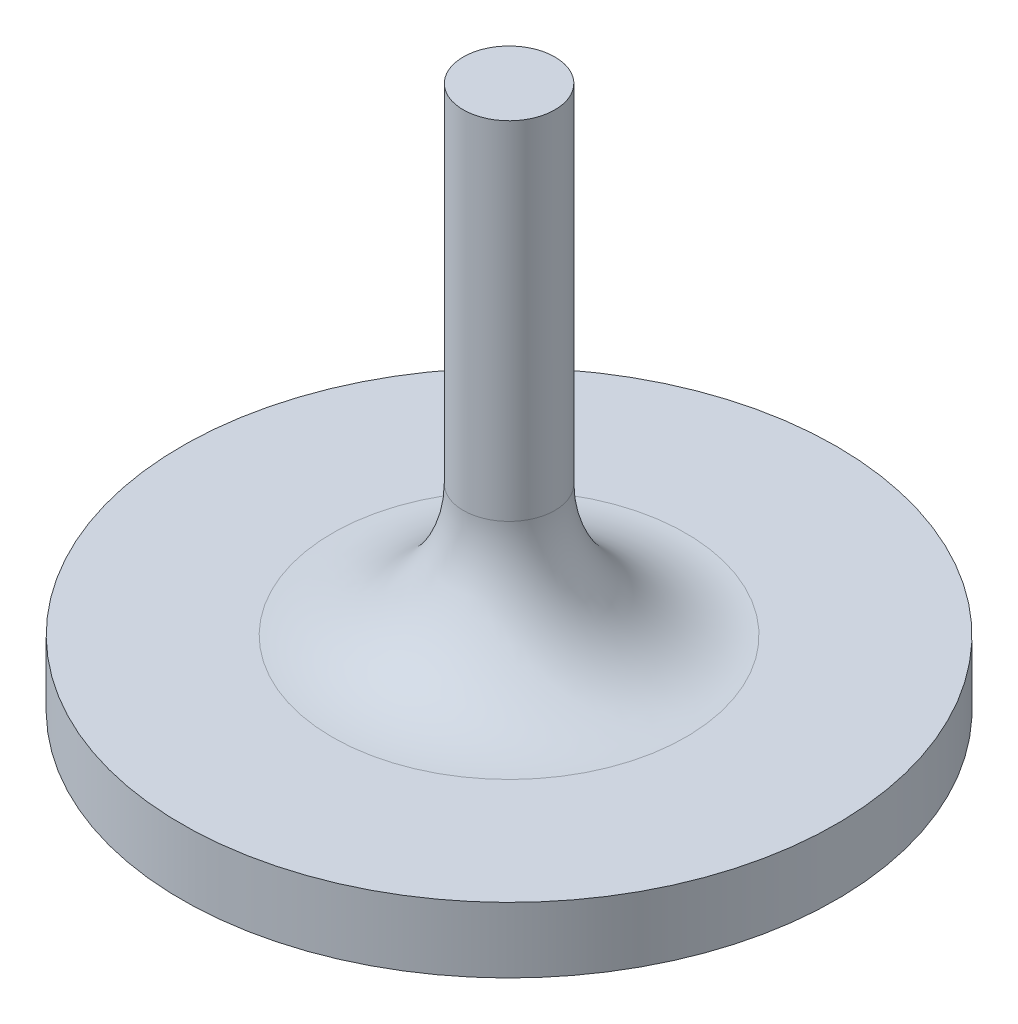
ISO-10303-21;
HEADER;
FILE_DESCRIPTION(('STEP AP214'),'2;1');
FILE_NAME('part.step','',(''),(''),'','','');
FILE_SCHEMA(('AUTOMOTIVE_DESIGN { 1 0 10303 214 1 1 1 1 }'));
ENDSEC;
DATA;
#1=APPLICATION_CONTEXT('core data for automotive mechanical design processes');
#2=APPLICATION_PROTOCOL_DEFINITION('international standard','automotive_design',2000,#1);
#3=PRODUCT_CONTEXT('',#1,'mechanical');
#4=PRODUCT('Part','Part','',(#3));
#5=PRODUCT_RELATED_PRODUCT_CATEGORY('part','',(#4));
#6=PRODUCT_DEFINITION_FORMATION('','',#4);
#7=PRODUCT_DEFINITION_CONTEXT('part definition',#1,'design');
#8=PRODUCT_DEFINITION('design','',#6,#7);
#9=PRODUCT_DEFINITION_SHAPE('','',#8);
#10=(LENGTH_UNIT() NAMED_UNIT(*) SI_UNIT(.MILLI.,.METRE.));
#11=(NAMED_UNIT(*) PLANE_ANGLE_UNIT() SI_UNIT($,.RADIAN.));
#12=(NAMED_UNIT(*) SI_UNIT($,.STERADIAN.) SOLID_ANGLE_UNIT());
#13=UNCERTAINTY_MEASURE_WITH_UNIT(LENGTH_MEASURE(1.E-05),#10,'distance_accuracy_value','');
#14=(GEOMETRIC_REPRESENTATION_CONTEXT(3) GLOBAL_UNCERTAINTY_ASSIGNED_CONTEXT((#13)) GLOBAL_UNIT_ASSIGNED_CONTEXT((#10,
#11,#12)) REPRESENTATION_CONTEXT('',''));
#15=CARTESIAN_POINT('',(0.,0.,0.));
#16=DIRECTION('',(0.,0.,1.));
#17=DIRECTION('',(1.,0.,0.));
#18=AXIS2_PLACEMENT_3D('',#15,#16,#17);
#19=CARTESIAN_POINT('',(0.,50.,0.));
#20=DIRECTION('',(0.,1.,0.));
#21=DIRECTION('',(0.,0.,1.));
#22=AXIS2_PLACEMENT_3D('',#19,#20,#21);
#23=PLANE('',#22);
#24=CARTESIAN_POINT('',(0.,50.,0.));
#25=DIRECTION('',(0.,-1.,0.));
#26=DIRECTION('',(0.,0.,-1.));
#27=AXIS2_PLACEMENT_3D('',#24,#25,#26);
#28=CIRCLE('',#27,3.5);
#29=CARTESIAN_POINT('',(0.,50.,-3.5));
#30=VERTEX_POINT('',#29);
#31=EDGE_CURVE('E136',#30,#30,#28,.T.);
#32=ORIENTED_EDGE('',*,*,#31,.F.);
#33=EDGE_LOOP('',(#32));
#34=FACE_BOUND('',#33,.T.);
#35=ADVANCED_FACE('F41',(#34),#23,.T.);
#36=CARTESIAN_POINT('',(0.,0.,0.));
#37=DIRECTION('',(0.,-1.,0.));
#38=DIRECTION('',(0.,0.,-1.));
#39=AXIS2_PLACEMENT_3D('',#36,#37,#38);
#40=CYLINDRICAL_SURFACE('',#39,3.5);
#41=CARTESIAN_POINT('',(0.,23.5,0.));
#42=DIRECTION('',(0.,1.,0.));
#43=DIRECTION('',(0.,0.,1.));
#44=AXIS2_PLACEMENT_3D('',#41,#42,#43);
#45=CIRCLE('',#44,3.5);
#46=CARTESIAN_POINT('',(0.,23.5,3.5));
#47=VERTEX_POINT('',#46);
#48=EDGE_CURVE('E12',#47,#47,#45,.T.);
#49=ORIENTED_EDGE('',*,*,#48,.T.);
#50=EDGE_LOOP('',(#49));
#51=FACE_BOUND('',#50,.T.);
#52=ORIENTED_EDGE('',*,*,#31,.T.);
#53=EDGE_LOOP('',(#52));
#54=FACE_BOUND('',#53,.T.);
#55=ADVANCED_FACE('F67',(#51,#54),#40,.T.);
#56=CARTESIAN_POINT('',(0.,13.5,-3.5));
#57=DIRECTION('',(0.,1.,0.));
#58=DIRECTION('',(0.,0.,1.));
#59=AXIS2_PLACEMENT_3D('',#56,#57,#58);
#60=PLANE('',#59);
#61=CARTESIAN_POINT('',(0.,13.5,0.));
#62=DIRECTION('',(0.,1.,0.));
#63=DIRECTION('',(0.,0.,1.));
#64=AXIS2_PLACEMENT_3D('',#61,#62,#63);
#65=CIRCLE('',#64,13.5);
#66=CARTESIAN_POINT('',(0.,13.5,13.5));
#67=VERTEX_POINT('',#66);
#68=EDGE_CURVE('E47',#67,#67,#65,.F.);
#69=ORIENTED_EDGE('',*,*,#68,.T.);
#70=EDGE_LOOP('',(#69));
#71=FACE_BOUND('',#70,.T.);
#72=CARTESIAN_POINT('',(0.,13.5,0.));
#73=DIRECTION('',(0.,-1.,0.));
#74=DIRECTION('',(0.,0.,-1.));
#75=AXIS2_PLACEMENT_3D('',#72,#73,#74);
#76=CIRCLE('',#75,25.);
#77=CARTESIAN_POINT('',(0.,13.5,-25.));
#78=VERTEX_POINT('',#77);
#79=EDGE_CURVE('E139',#78,#78,#76,.T.);
#80=ORIENTED_EDGE('',*,*,#79,.F.);
#81=EDGE_LOOP('',(#80));
#82=FACE_BOUND('',#81,.T.);
#83=ADVANCED_FACE('F73',(#71,#82),#60,.T.);
#84=CARTESIAN_POINT('',(0.,0.,0.));
#85=DIRECTION('',(0.,-1.,0.));
#86=DIRECTION('',(0.,0.,-1.));
#87=AXIS2_PLACEMENT_3D('',#84,#85,#86);
#88=CYLINDRICAL_SURFACE('',#87,25.);
#89=ORIENTED_EDGE('',*,*,#79,.T.);
#90=EDGE_LOOP('',(#89));
#91=FACE_BOUND('',#90,.T.);
#92=CARTESIAN_POINT('',(0.,8.50000000000002,0.));
#93=DIRECTION('',(0.,-1.,0.));
#94=DIRECTION('',(0.,0.,-1.));
#95=AXIS2_PLACEMENT_3D('',#92,#93,#94);
#96=CIRCLE('',#95,25.);
#97=CARTESIAN_POINT('',(0.,8.50000000000002,-25.));
#98=VERTEX_POINT('',#97);
#99=EDGE_CURVE('E143',#98,#98,#96,.T.);
#100=ORIENTED_EDGE('',*,*,#99,.F.);
#101=EDGE_LOOP('',(#100));
#102=FACE_BOUND('',#101,.T.);
#103=ADVANCED_FACE('F61',(#91,#102),#88,.T.);
#104=CARTESIAN_POINT('',(0.,8.50000000000002,-25.));
#105=DIRECTION('',(0.,-1.,0.));
#106=DIRECTION('',(0.,0.,-1.));
#107=AXIS2_PLACEMENT_3D('',#104,#105,#106);
#108=PLANE('',#107);
#109=CARTESIAN_POINT('',(0.,8.50000000000002,-18.5));
#110=CARTESIAN_POINT('',(2.42164433596982,8.50000000000002,-18.5));
#111=CARTESIAN_POINT('',(4.84233586173911,8.50000000000002,-18.0184945179174));
#112=CARTESIAN_POINT('',(9.31695113576922,8.50000000000002,-16.1650481850002));
#113=CARTESIAN_POINT('',(11.3691143203774,8.50000000000002,-14.7938365835291));
#114=CARTESIAN_POINT('',(14.7938365835249,8.50000000000002,-11.3691143203732));
#115=CARTESIAN_POINT('',(16.1650481850054,8.50000000000002,-9.31695113576902));
#116=CARTESIAN_POINT('',(18.0184945179122,8.50000000000002,-4.8423358617393));
#117=CARTESIAN_POINT('',(18.5,8.50000000000002,-2.42164433596286));
#118=CARTESIAN_POINT('',(18.5,8.50000000000002,2.42164433596285));
#119=CARTESIAN_POINT('',(18.0184945179122,8.50000000000002,4.8423358617351));
#120=CARTESIAN_POINT('',(16.1650481850054,8.50000000000002,9.31695113577322));
#121=CARTESIAN_POINT('',(14.7938365835381,8.50000000000002,11.3691143203788));
#122=CARTESIAN_POINT('',(11.3691143203641,8.50000000000002,14.7938365835235));
#123=CARTESIAN_POINT('',(9.31695113576799,8.50000000000002,16.1650481850012));
#124=CARTESIAN_POINT('',(4.84233586174038,8.50000000000002,18.0184945179164));
#125=CARTESIAN_POINT('',(2.42164433596286,8.50000000000002,18.5));
#126=CARTESIAN_POINT('',(-2.42164433596285,8.50000000000002,18.5));
#127=CARTESIAN_POINT('',(-4.84233586173403,8.50000000000002,18.0184945179122));
#128=CARTESIAN_POINT('',(-9.31695113577425,8.50000000000002,16.1650481850054));
#129=CARTESIAN_POINT('',(-11.3691143203704,8.50000000000002,14.7938365835297));
#130=CARTESIAN_POINT('',(-14.7938365835319,8.50000000000002,11.3691143203725));
#131=CARTESIAN_POINT('',(-16.165048185018,8.50000000000002,9.31695113577324));
#132=CARTESIAN_POINT('',(-18.0184945178996,8.50000000000002,4.84233586173512));
#133=CARTESIAN_POINT('',(-18.5,8.50000000000002,2.42164433596283));
#134=CARTESIAN_POINT('',(-18.5,8.50000000000002,-2.42164433596289));
#135=CARTESIAN_POINT('',(-18.0184945179164,8.50000000000002,-4.84233586173507));
#136=CARTESIAN_POINT('',(-16.1650481850012,8.50000000000002,-9.31695113577319));
#137=CARTESIAN_POINT('',(-14.7938365835319,8.50000000000002,-11.3691143203704));
#138=CARTESIAN_POINT('',(-11.3691143203705,8.50000000000002,-14.7938365835318));
#139=CARTESIAN_POINT('',(-9.31695113577429,8.50000000000002,-16.1650481850054));
#140=CARTESIAN_POINT('',(-4.84233586173408,8.50000000000002,-18.0184945179122));
#141=CARTESIAN_POINT('',(-2.42164433596983,8.50000000000002,-18.5));
#142=CARTESIAN_POINT('',(0.,8.50000000000002,-18.5));
#143=(BOUNDED_CURVE() B_SPLINE_CURVE(3,(#109,#110,#111,#112,#113,#114,#115,#116,#117,#118,#119,
#120,#121,#122,#123,#124,#125,#126,#127,#128,#129,#130,#131,#132,#133,#134,#135,#136,#137,#138,
#139,#140,#141,#142),.UNSPECIFIED.,.T.,.F.) B_SPLINE_CURVE_WITH_KNOTS((4,2,2,2,2,2,2,2,2,2,2,2,
2,2,2,2,4),(0.,0.392699081698724,0.785398163397448,1.17809724509617,1.5707963267949,
1.96349540849362,2.35619449019234,2.74889357189107,3.14159265358979,3.53429173528852,
3.92699081698724,4.31968989868597,4.71238898038469,5.10508806208341,5.49778714378214,
5.89048622548086,6.28318530717959),
.UNSPECIFIED.) CURVE() GEOMETRIC_REPRESENTATION_ITEM() RATIONAL_B_SPLINE_CURVE((1.,1.,1.,1.,1.,
1.,1.,1.,1.,1.,1.,1.,1.,1.,1.,1.,1.,1.,1.,1.,1.,1.,1.,1.,1.,1.,1.,1.,1.,1.,1.,1.,1.,1.)) REPRESENTATION_ITEM(''));
#144=CARTESIAN_POINT('',(0.,8.50000000000002,-18.5));
#145=VERTEX_POINT('',#144);
#146=EDGE_CURVE('E132',#145,#145,#143,.F.);
#147=ORIENTED_EDGE('',*,*,#146,.T.);
#148=EDGE_LOOP('',(#147));
#149=FACE_BOUND('',#148,.T.);
#150=ORIENTED_EDGE('',*,*,#99,.T.);
#151=EDGE_LOOP('',(#150));
#152=FACE_BOUND('',#151,.T.);
#153=ADVANCED_FACE('F53',(#149,#152),#108,.T.);
#154=CARTESIAN_POINT('',(0.,0.,0.));
#155=DIRECTION('',(0.,1.,0.));
#156=DIRECTION('',(0.,0.,1.));
#157=AXIS2_PLACEMENT_3D('',#154,#155,#156);
#158=CONICAL_SURFACE('',#157,0.,0.785398163397446);
#159=CARTESIAN_POINT('',(0.,3.50000000000002,-3.50000000000001));
#160=CARTESIAN_POINT('',(-0.458148928426724,3.50000000000002,-3.50000000000001));
#161=CARTESIAN_POINT('',(-0.916117595461985,3.50000000000002,-3.40890436824992));
#162=CARTESIAN_POINT('',(-1.76266643109366,3.50000000000002,-3.05825235932909));
#163=CARTESIAN_POINT('',(-2.15091352007043,3.49999999999582,-2.79883394823331));
#164=CARTESIAN_POINT('',(-2.79883394823542,3.50000000000423,-2.15091352007252));
#165=CARTESIAN_POINT('',(-3.0582523593228,3.50000000000002,-1.7626664310926));
#166=CARTESIAN_POINT('',(-3.40890436825622,3.50000000000002,-0.916117595463026));
#167=CARTESIAN_POINT('',(-3.50000000000001,3.50000000000002,-0.458148928425413));
#168=CARTESIAN_POINT('',(-3.50000000000001,3.50000000000002,0.458148928425401));
#169=CARTESIAN_POINT('',(-3.40890436824782,3.50000000000843,0.916117595463033));
#170=CARTESIAN_POINT('',(-3.05825235933119,3.49999999999162,1.76266643109261));
#171=CARTESIAN_POINT('',(-2.79883394823752,3.50000000000002,2.15091352007042));
#172=CARTESIAN_POINT('',(-2.15091352006832,3.50000000000002,2.79883394823541));
#173=CARTESIAN_POINT('',(-1.76266643109155,3.50000000000002,3.0582523593249));
#174=CARTESIAN_POINT('',(-0.916117595464076,3.50000000000002,3.40890436825413));
#175=CARTESIAN_POINT('',(-0.458148928425406,3.50000000000002,3.50000000000001));
#176=CARTESIAN_POINT('',(0.458148928425406,3.50000000000002,3.50000000000001));
#177=CARTESIAN_POINT('',(0.916117595461985,3.50000000000002,3.40890436825412));
#178=CARTESIAN_POINT('',(1.76266643109366,3.50000000000002,3.05825235932489));
#179=CARTESIAN_POINT('',(2.15091352006412,3.50000000000842,2.79883394823122));
#180=CARTESIAN_POINT('',(2.79883394824172,3.49999999999162,2.15091352007463));
#181=CARTESIAN_POINT('',(3.05825235932489,3.50000000000002,1.76266643109155));
#182=CARTESIAN_POINT('',(3.40890436825412,3.50000000000002,0.916117595464081));
#183=CARTESIAN_POINT('',(3.50000000000001,3.50000000000002,0.458148928425406));
#184=CARTESIAN_POINT('',(3.50000000000001,3.50000000000002,-0.458148928425407));
#185=CARTESIAN_POINT('',(3.40890436825203,3.50000000000002,-0.916117595461979));
#186=CARTESIAN_POINT('',(3.058252359327,3.50000000000002,-1.76266643109365));
#187=CARTESIAN_POINT('',(2.79883394823608,3.50000000000002,-2.15091352006976));
#188=CARTESIAN_POINT('',(2.15091352006976,3.50000000000002,-2.79883394823608));
#189=CARTESIAN_POINT('',(1.76266643109199,3.50000000000843,-3.05825235932052));
#190=CARTESIAN_POINT('',(0.916117595463645,3.49999999999162,-3.4089043682585));
#191=CARTESIAN_POINT('',(0.458148928426724,3.50000000000002,-3.50000000000001));
#192=CARTESIAN_POINT('',(0.,3.50000000000002,-3.50000000000001));
#193=(BOUNDED_CURVE() B_SPLINE_CURVE(3,(#159,#160,#161,#162,#163,#164,#165,#166,#167,#168,#169,
#170,#171,#172,#173,#174,#175,#176,#177,#178,#179,#180,#181,#182,#183,#184,#185,#186,#187,#188,
#189,#190,#191,#192),.UNSPECIFIED.,.T.,.F.) B_SPLINE_CURVE_WITH_KNOTS((4,2,2,2,2,2,2,2,2,2,2,2,
2,2,2,2,4),(0.,0.392699081698725,0.785398163397448,1.17809724509617,1.5707963267949,
1.96349540849362,2.35619449019234,2.74889357189107,3.14159265358979,3.53429173528852,
3.92699081698724,4.31968989868597,4.71238898038469,5.10508806208341,5.49778714378214,
5.89048622548086,6.28318530717959),
.UNSPECIFIED.) CURVE() GEOMETRIC_REPRESENTATION_ITEM() RATIONAL_B_SPLINE_CURVE((1.,1.,1.,1.,1.,
1.,1.,1.,1.,1.,1.,1.,1.,1.,1.,1.,1.,1.,1.,1.,1.,1.,1.,1.,1.,1.,1.,1.,1.,1.,1.,1.,1.,1.)) REPRESENTATION_ITEM(''));
#194=CARTESIAN_POINT('',(0.,3.50000000000002,-3.50000000000001));
#195=VERTEX_POINT('',#194);
#196=EDGE_CURVE('E123',#195,#195,#193,.F.);
#197=ORIENTED_EDGE('',*,*,#196,.T.);
#198=EDGE_LOOP('',(#197));
#199=FACE_BOUND('',#198,.T.);
#200=CARTESIAN_POINT('',(0.,0.,0.));
#201=VERTEX_POINT('',#200);
#202=VERTEX_LOOP('',#201);
#203=FACE_BOUND('',#202,.T.);
#204=ADVANCED_FACE('F50',(#199,#203),#158,.T.);
#205=CARTESIAN_POINT('',(0.,3.50000000000002,-3.50000000000001));
#206=CARTESIAN_POINT('',(0.458148928426724,3.50000000000002,-3.50000000000001));
#207=CARTESIAN_POINT('',(0.916117595463645,3.49999999999162,-3.4089043682585));
#208=CARTESIAN_POINT('',(1.76266643109199,3.50000000000843,-3.05825235932052));
#209=CARTESIAN_POINT('',(2.15091352006976,3.50000000000002,-2.79883394823608));
#210=CARTESIAN_POINT('',(2.79883394823608,3.50000000000002,-2.15091352006976));
#211=CARTESIAN_POINT('',(3.058252359327,3.50000000000002,-1.76266643109365));
#212=CARTESIAN_POINT('',(3.40890436825203,3.50000000000002,-0.916117595461979));
#213=CARTESIAN_POINT('',(3.50000000000001,3.50000000000002,-0.458148928425407));
#214=CARTESIAN_POINT('',(3.50000000000001,3.50000000000002,0.458148928425406));
#215=CARTESIAN_POINT('',(3.40890436825412,3.50000000000002,0.916117595464081));
#216=CARTESIAN_POINT('',(3.05825235932489,3.50000000000002,1.76266643109155));
#217=CARTESIAN_POINT('',(2.79883394824172,3.49999999999162,2.15091352007463));
#218=CARTESIAN_POINT('',(2.15091352006412,3.50000000000842,2.79883394823122));
#219=CARTESIAN_POINT('',(1.76266643109366,3.50000000000002,3.05825235932489));
#220=CARTESIAN_POINT('',(0.916117595461985,3.50000000000002,3.40890436825412));
#221=CARTESIAN_POINT('',(0.458148928425406,3.50000000000002,3.50000000000001));
#222=CARTESIAN_POINT('',(-0.458148928425406,3.50000000000002,3.50000000000001));
#223=CARTESIAN_POINT('',(-0.916117595464076,3.50000000000002,3.40890436825413));
#224=CARTESIAN_POINT('',(-1.76266643109155,3.50000000000002,3.0582523593249));
#225=CARTESIAN_POINT('',(-2.15091352006832,3.50000000000002,2.79883394823541));
#226=CARTESIAN_POINT('',(-2.79883394823752,3.50000000000002,2.15091352007042));
#227=CARTESIAN_POINT('',(-3.05825235933119,3.49999999999162,1.76266643109261));
#228=CARTESIAN_POINT('',(-3.40890436824782,3.50000000000843,0.916117595463033));
#229=CARTESIAN_POINT('',(-3.50000000000001,3.50000000000002,0.458148928425401));
#230=CARTESIAN_POINT('',(-3.50000000000001,3.50000000000002,-0.458148928425413));
#231=CARTESIAN_POINT('',(-3.40890436825622,3.50000000000002,-0.916117595463026));
#232=CARTESIAN_POINT('',(-3.0582523593228,3.50000000000002,-1.7626664310926));
#233=CARTESIAN_POINT('',(-2.79883394823542,3.50000000000423,-2.15091352007252));
#234=CARTESIAN_POINT('',(-2.15091352007043,3.49999999999582,-2.79883394823331));
#235=CARTESIAN_POINT('',(-1.76266643109366,3.50000000000002,-3.05825235932909));
#236=CARTESIAN_POINT('',(-0.916117595461985,3.50000000000002,-3.40890436824992));
#237=CARTESIAN_POINT('',(-0.458148928426724,3.50000000000002,-3.50000000000001));
#238=CARTESIAN_POINT('',(0.,3.50000000000002,-3.50000000000001));
#239=CARTESIAN_POINT('',(0.,8.50000000000002,-10.1666666666667));
#240=CARTESIAN_POINT('',(1.33081355400144,8.50000000000002,-10.1666666666667));
#241=CARTESIAN_POINT('',(2.66110349159377,8.49999999999582,-9.90205554590544));
#242=CARTESIAN_POINT('',(5.12012629982972,8.50000000000423,-8.88349494849073));
#243=CARTESIAN_POINT('',(6.24789165353935,8.50000000000002,-8.12994623058816));
#244=CARTESIAN_POINT('',(8.12994623058711,8.50000000000002,-6.2478916535383));
#245=CARTESIAN_POINT('',(8.88349494852487,8.50000000000212,-5.12012629984106));
#246=CARTESIAN_POINT('',(9.90205554587132,8.49999999999792,-2.66110349158243));
#247=CARTESIAN_POINT('',(10.1666666666667,8.50000000000002,-1.33081355399761));
#248=CARTESIAN_POINT('',(10.1666666666667,8.50000000000002,1.33081355399761));
#249=CARTESIAN_POINT('',(9.90205554588601,8.50000000000212,2.66110349158663));
#250=CARTESIAN_POINT('',(8.88349494851015,8.49999999999792,5.12012629983686));
#251=CARTESIAN_POINT('',(8.12994623060198,8.49999999998531,6.24789165355075));
#252=CARTESIAN_POINT('',(6.24789165352449,8.50000000001472,8.12994623057574));
#253=CARTESIAN_POINT('',(5.12012629984055,8.50000000000213,8.88349494851856));
#254=CARTESIAN_POINT('',(2.66110349158297,8.49999999999792,9.90205554587761));
#255=CARTESIAN_POINT('',(1.33081355399761,8.50000000000002,10.1666666666667));
#256=CARTESIAN_POINT('',(-1.33081355399761,8.50000000000002,10.1666666666667));
#257=CARTESIAN_POINT('',(-2.6611034915861,8.50000000000212,9.90205554588603));
#258=CARTESIAN_POINT('',(-5.12012629983738,8.49999999999792,8.88349494851017));
#259=CARTESIAN_POINT('',(-6.24789165354234,8.50000000000002,8.12994623059462));
#260=CARTESIAN_POINT('',(-8.12994623058413,8.50000000000002,6.24789165353183));
#261=CARTESIAN_POINT('',(-8.88349494853115,8.49999999998952,5.12012629984212));
#262=CARTESIAN_POINT('',(-9.902055545865,8.50000000001053,2.66110349158139));
#263=CARTESIAN_POINT('',(-10.1666666666667,8.50000000000002,1.33081355399759));
#264=CARTESIAN_POINT('',(-10.1666666666667,8.50000000000002,-1.33081355399763));
#265=CARTESIAN_POINT('',(-9.90205554588602,8.50000000000002,-2.66110349158399));
#266=CARTESIAN_POINT('',(-8.88349494851016,8.50000000000002,-5.12012629983947));
#267=CARTESIAN_POINT('',(-8.12994623058939,8.49999999998532,-6.24789165353811));
#268=CARTESIAN_POINT('',(-6.24789165353711,8.50000000001473,-8.1299462305883));
#269=CARTESIAN_POINT('',(-5.12012629984107,8.50000000000002,-8.88349494851855));
#270=CARTESIAN_POINT('',(-2.66110349158244,8.50000000000002,-9.9020555458776));
#271=CARTESIAN_POINT('',(-1.33081355400144,8.50000000000002,-10.1666666666667));
#272=CARTESIAN_POINT('',(0.,8.50000000000002,-10.1666666666667));
#273=CARTESIAN_POINT('',(0.,8.50000000000002,-18.5));
#274=CARTESIAN_POINT('',(2.42164433596982,8.50000000000002,-18.5));
#275=CARTESIAN_POINT('',(4.84233586173911,8.50000000000002,-18.0184945179174));
#276=CARTESIAN_POINT('',(9.31695113576922,8.50000000000002,-16.1650481850002));
#277=CARTESIAN_POINT('',(11.3691143203774,8.50000000000002,-14.7938365835291));
#278=CARTESIAN_POINT('',(14.7938365835249,8.50000000000002,-11.3691143203732));
#279=CARTESIAN_POINT('',(16.1650481850054,8.50000000000002,-9.31695113576902));
#280=CARTESIAN_POINT('',(18.0184945179122,8.50000000000002,-4.8423358617393));
#281=CARTESIAN_POINT('',(18.5,8.50000000000002,-2.42164433596286));
#282=CARTESIAN_POINT('',(18.5,8.50000000000002,2.42164433596286));
#283=CARTESIAN_POINT('',(18.0184945179122,8.50000000000002,4.84233586173511));
#284=CARTESIAN_POINT('',(16.1650481850054,8.50000000000002,9.31695113577323));
#285=CARTESIAN_POINT('',(14.7938365835381,8.50000000000002,11.3691143203788));
#286=CARTESIAN_POINT('',(11.3691143203641,8.50000000000002,14.7938365835235));
#287=CARTESIAN_POINT('',(9.316951135768,8.50000000000002,16.1650481850012));
#288=CARTESIAN_POINT('',(4.84233586174038,8.50000000000002,18.0184945179164));
#289=CARTESIAN_POINT('',(2.42164433596286,8.50000000000002,18.5));
#290=CARTESIAN_POINT('',(-2.42164433596286,8.50000000000002,18.5));
#291=CARTESIAN_POINT('',(-4.84233586173403,8.50000000000002,18.0184945179122));
#292=CARTESIAN_POINT('',(-9.31695113577425,8.50000000000002,16.1650481850054));
#293=CARTESIAN_POINT('',(-11.3691143203704,8.50000000000002,14.7938365835297));
#294=CARTESIAN_POINT('',(-14.7938365835319,8.50000000000002,11.3691143203725));
#295=CARTESIAN_POINT('',(-16.165048185018,8.50000000000002,9.31695113577324));
#296=CARTESIAN_POINT('',(-18.0184945178996,8.50000000000002,4.84233586173513));
#297=CARTESIAN_POINT('',(-18.5,8.50000000000002,2.42164433596283));
#298=CARTESIAN_POINT('',(-18.5,8.50000000000002,-2.42164433596289));
#299=CARTESIAN_POINT('',(-18.0184945179164,8.50000000000002,-4.84233586173508));
#300=CARTESIAN_POINT('',(-16.1650481850012,8.50000000000002,-9.31695113577319));
#301=CARTESIAN_POINT('',(-14.7938365835319,8.50000000000002,-11.3691143203704));
#302=CARTESIAN_POINT('',(-11.3691143203705,8.50000000000002,-14.7938365835318));
#303=CARTESIAN_POINT('',(-9.3169511357743,8.50000000000002,-16.1650481850054));
#304=CARTESIAN_POINT('',(-4.84233586173408,8.50000000000002,-18.0184945179122));
#305=CARTESIAN_POINT('',(-2.42164433596983,8.50000000000002,-18.5));
#306=CARTESIAN_POINT('',(0.,8.50000000000002,-18.5));
#307=(BOUNDED_SURFACE() B_SPLINE_SURFACE(2,3,((#205,#206,#207,#208,#209,#210,#211,#212,#213,
#214,#215,#216,#217,#218,#219,#220,#221,#222,#223,#224,#225,#226,#227,#228,#229,#230,#231,#232,
#233,#234,#235,#236,#237,#238),(#239,#240,#241,#242,#243,#244,#245,#246,#247,#248,#249,#250,
#251,#252,#253,#254,#255,#256,#257,#258,#259,#260,#261,#262,#263,#264,#265,#266,#267,#268,#269,
#270,#271,#272),(#273,#274,#275,#276,#277,#278,#279,#280,#281,#282,#283,#284,#285,#286,#287,
#288,#289,#290,#291,#292,#293,#294,#295,#296,#297,#298,#299,#300,#301,#302,#303,#304,#305,
#306)),.UNSPECIFIED.,.F.,.T.,.F.) B_SPLINE_SURFACE_WITH_KNOTS((3,3),(4,2,2,2,2,2,2,2,2,2,2,2,2,
2,2,2,4),(0.,1.),(0.,0.392699081698724,0.785398163397448,1.17809724509617,1.5707963267949,
1.96349540849362,2.35619449019234,2.74889357189107,3.14159265358979,3.53429173528852,
3.92699081698724,4.31968989868597,4.71238898038469,5.10508806208341,5.49778714378214,
5.89048622548086,6.28318530717959),
.UNSPECIFIED.) GEOMETRIC_REPRESENTATION_ITEM() RATIONAL_B_SPLINE_SURFACE(((1.,1.,1.,1.,1.,1.,1.,
1.,1.,1.,1.,1.,1.,1.,1.,1.,1.,1.,1.,1.,1.,1.,1.,1.,1.,1.,1.,1.,1.,1.,1.,1.,1.,1.),(1.,1.,1.,1.,
1.,1.,1.,1.,1.,1.,1.,1.,1.,1.,1.,1.,1.,1.,1.,1.,1.,1.,1.,1.,1.,1.,1.,1.,1.,1.,1.,1.,1.,1.),(1.,
1.,1.,1.,1.,1.,1.,1.,1.,1.,1.,1.,1.,1.,1.,1.,1.,1.,1.,1.,1.,1.,1.,1.,1.,1.,1.,1.,1.,1.,1.,1.,1.,1.))) REPRESENTATION_ITEM('') SURFACE());
#308=ORIENTED_EDGE('',*,*,#146,.F.);
#309=EDGE_LOOP('',(#308));
#310=FACE_BOUND('',#309,.T.);
#311=ORIENTED_EDGE('',*,*,#196,.F.);
#312=EDGE_LOOP('',(#311));
#313=FACE_BOUND('',#312,.T.);
#314=ADVANCED_FACE('F52',(#310,#313),#307,.T.);
#315=CARTESIAN_POINT('',(0.,23.5,0.));
#316=DIRECTION('',(0.,1.,0.));
#317=DIRECTION('',(0.,0.,1.));
#318=AXIS2_PLACEMENT_3D('',#315,#316,#317);
#319=TOROIDAL_SURFACE('',#318,13.5,10.);
#320=ORIENTED_EDGE('',*,*,#48,.F.);
#321=EDGE_LOOP('',(#320));
#322=FACE_BOUND('',#321,.T.);
#323=ORIENTED_EDGE('',*,*,#68,.F.);
#324=EDGE_LOOP('',(#323));
#325=FACE_BOUND('',#324,.T.);
#326=ADVANCED_FACE('F43',(#322,#325),#319,.F.);
#327=CLOSED_SHELL('',(#35,#55,#83,#103,#153,#204,#314,#326));
#328=MANIFOLD_SOLID_BREP('B2',#327);
#329=ADVANCED_BREP_SHAPE_REPRESENTATION('',(#18,#328),#14);
#330=SHAPE_DEFINITION_REPRESENTATION(#9,#329);
ENDSEC;
END-ISO-10303-21;
